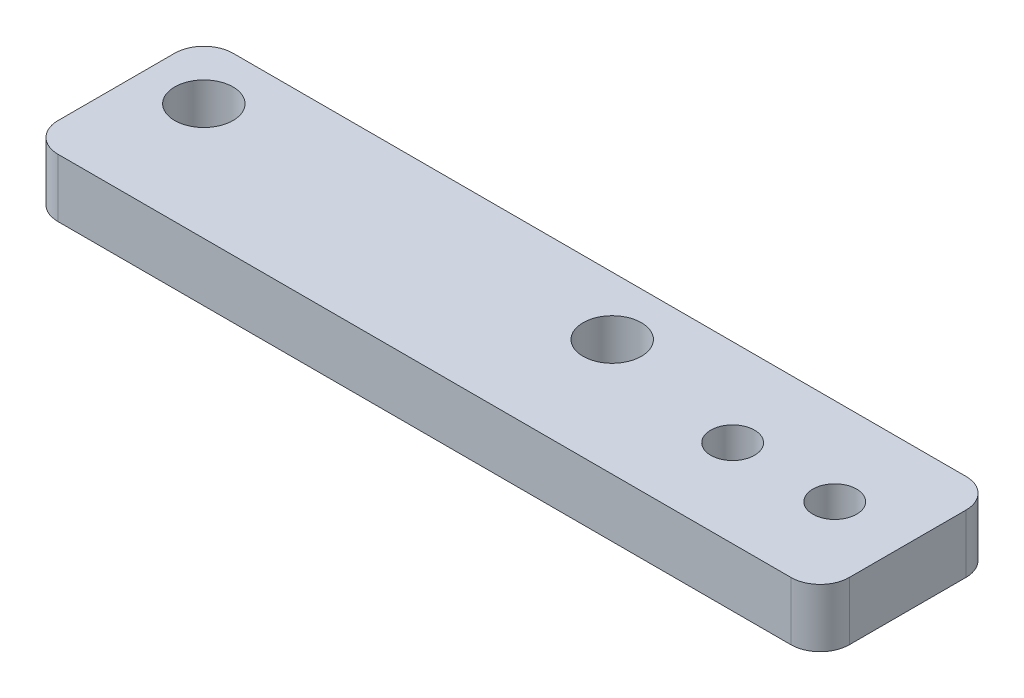
ISO-10303-21;
HEADER;
FILE_DESCRIPTION(('STEP AP214'),'2;1');
FILE_NAME('part.step','',(''),(''),'','','');
FILE_SCHEMA(('AUTOMOTIVE_DESIGN { 1 0 10303 214 1 1 1 1 }'));
ENDSEC;
DATA;
#1=APPLICATION_CONTEXT('core data for automotive mechanical design processes');
#2=APPLICATION_PROTOCOL_DEFINITION('international standard','automotive_design',2000,#1);
#3=PRODUCT_CONTEXT('',#1,'mechanical');
#4=PRODUCT('Part','Part','',(#3));
#5=PRODUCT_RELATED_PRODUCT_CATEGORY('part','',(#4));
#6=PRODUCT_DEFINITION_FORMATION('','',#4);
#7=PRODUCT_DEFINITION_CONTEXT('part definition',#1,'design');
#8=PRODUCT_DEFINITION('design','',#6,#7);
#9=PRODUCT_DEFINITION_SHAPE('','',#8);
#10=(LENGTH_UNIT() NAMED_UNIT(*) SI_UNIT(.MILLI.,.METRE.));
#11=(NAMED_UNIT(*) PLANE_ANGLE_UNIT() SI_UNIT($,.RADIAN.));
#12=(NAMED_UNIT(*) SI_UNIT($,.STERADIAN.) SOLID_ANGLE_UNIT());
#13=UNCERTAINTY_MEASURE_WITH_UNIT(LENGTH_MEASURE(1.E-05),#10,'distance_accuracy_value','');
#14=(GEOMETRIC_REPRESENTATION_CONTEXT(3) GLOBAL_UNCERTAINTY_ASSIGNED_CONTEXT((#13)) GLOBAL_UNIT_ASSIGNED_CONTEXT((#10,
#11,#12)) REPRESENTATION_CONTEXT('',''));
#15=CARTESIAN_POINT('',(0.,0.,0.));
#16=DIRECTION('',(0.,0.,1.));
#17=DIRECTION('',(1.,0.,0.));
#18=AXIS2_PLACEMENT_3D('',#15,#16,#17);
#19=CARTESIAN_POINT('',(0.,4.,0.));
#20=DIRECTION('',(0.,1.,0.));
#21=DIRECTION('',(0.,0.,1.));
#22=AXIS2_PLACEMENT_3D('',#19,#20,#21);
#23=PLANE('',#22);
#24=CARTESIAN_POINT('',(-23.1284134973693,4.,-2.));
#25=DIRECTION('',(0.,1.,0.));
#26=DIRECTION('',(0.,0.,1.));
#27=AXIS2_PLACEMENT_3D('',#24,#25,#26);
#28=CIRCLE('',#27,2.);
#29=CARTESIAN_POINT('',(-23.1284134973693,4.,0.));
#30=VERTEX_POINT('',#29);
#31=EDGE_CURVE('E184',#30,#30,#28,.T.);
#32=ORIENTED_EDGE('',*,*,#31,.F.);
#33=EDGE_LOOP('',(#32));
#34=FACE_BOUND('',#33,.T.);
#35=CARTESIAN_POINT('',(15.1284134973693,4.,0.));
#36=DIRECTION('',(0.,1.,0.));
#37=DIRECTION('',(0.,0.,1.));
#38=AXIS2_PLACEMENT_3D('',#35,#36,#37);
#39=CIRCLE('',#38,1.5);
#40=CARTESIAN_POINT('',(15.1284134973693,4.,1.5));
#41=VERTEX_POINT('',#40);
#42=EDGE_CURVE('E167',#41,#41,#39,.T.);
#43=ORIENTED_EDGE('',*,*,#42,.F.);
#44=EDGE_LOOP('',(#43));
#45=FACE_BOUND('',#44,.T.);
#46=DIRECTION('',(-1.,0.,0.));
#47=VECTOR('',#46,1.);
#48=CARTESIAN_POINT('',(-27.1284134973693,4.,-6.));
#49=LINE('',#48,#47);
#50=CARTESIAN_POINT('',(25.1284134973693,4.,-6.));
#51=VERTEX_POINT('',#50);
#52=CARTESIAN_POINT('',(-25.1284134973693,4.,-6.));
#53=VERTEX_POINT('',#52);
#54=EDGE_CURVE('E174',#51,#53,#49,.T.);
#55=ORIENTED_EDGE('',*,*,#54,.T.);
#56=CARTESIAN_POINT('',(-25.1284134973693,4.,-4.));
#57=DIRECTION('',(0.,1.,0.));
#58=DIRECTION('',(0.,0.,1.));
#59=AXIS2_PLACEMENT_3D('',#56,#57,#58);
#60=CIRCLE('',#59,2.);
#61=CARTESIAN_POINT('',(-27.1284134973693,4.,-4.));
#62=VERTEX_POINT('',#61);
#63=EDGE_CURVE('E151',#53,#62,#60,.T.);
#64=ORIENTED_EDGE('',*,*,#63,.T.);
#65=DIRECTION('',(0.,0.,1.));
#66=VECTOR('',#65,1.);
#67=CARTESIAN_POINT('',(-27.1284134973693,4.,-6.));
#68=LINE('',#67,#66);
#69=CARTESIAN_POINT('',(-27.1284134973693,4.,4.));
#70=VERTEX_POINT('',#69);
#71=EDGE_CURVE('E121',#62,#70,#68,.T.);
#72=ORIENTED_EDGE('',*,*,#71,.T.);
#73=CARTESIAN_POINT('',(-25.1284134973693,4.,4.));
#74=DIRECTION('',(0.,1.,0.));
#75=DIRECTION('',(0.,0.,1.));
#76=AXIS2_PLACEMENT_3D('',#73,#74,#75);
#77=CIRCLE('',#76,2.);
#78=CARTESIAN_POINT('',(-25.1284134973693,4.,6.));
#79=VERTEX_POINT('',#78);
#80=EDGE_CURVE('E58',#70,#79,#77,.T.);
#81=ORIENTED_EDGE('',*,*,#80,.T.);
#82=DIRECTION('',(1.,0.,0.));
#83=VECTOR('',#82,1.);
#84=CARTESIAN_POINT('',(-27.1284134973693,4.,6.));
#85=LINE('',#84,#83);
#86=CARTESIAN_POINT('',(25.1284134973693,4.,6.));
#87=VERTEX_POINT('',#86);
#88=EDGE_CURVE('E137',#79,#87,#85,.T.);
#89=ORIENTED_EDGE('',*,*,#88,.T.);
#90=CARTESIAN_POINT('',(25.1284134973693,4.,4.));
#91=DIRECTION('',(0.,1.,0.));
#92=DIRECTION('',(0.,0.,1.));
#93=AXIS2_PLACEMENT_3D('',#90,#91,#92);
#94=CIRCLE('',#93,2.);
#95=CARTESIAN_POINT('',(27.1284134973693,4.,4.));
#96=VERTEX_POINT('',#95);
#97=EDGE_CURVE('E146',#87,#96,#94,.T.);
#98=ORIENTED_EDGE('',*,*,#97,.T.);
#99=DIRECTION('',(0.,0.,-1.));
#100=VECTOR('',#99,1.);
#101=CARTESIAN_POINT('',(27.1284134973693,4.,-6.));
#102=LINE('',#101,#100);
#103=CARTESIAN_POINT('',(27.1284134973693,4.,-4.));
#104=VERTEX_POINT('',#103);
#105=EDGE_CURVE('E131',#96,#104,#102,.T.);
#106=ORIENTED_EDGE('',*,*,#105,.T.);
#107=CARTESIAN_POINT('',(25.1284134973693,4.,-4.));
#108=DIRECTION('',(0.,1.,0.));
#109=DIRECTION('',(0.,0.,1.));
#110=AXIS2_PLACEMENT_3D('',#107,#108,#109);
#111=CIRCLE('',#110,2.);
#112=EDGE_CURVE('E148',#104,#51,#111,.T.);
#113=ORIENTED_EDGE('',*,*,#112,.T.);
#114=EDGE_LOOP('',(#55,#64,#72,#81,#89,#98,#106,#113));
#115=FACE_BOUND('',#114,.T.);
#116=CARTESIAN_POINT('',(22.1284134973693,4.,0.));
#117=DIRECTION('',(0.,1.,0.));
#118=DIRECTION('',(0.,0.,1.));
#119=AXIS2_PLACEMENT_3D('',#116,#117,#118);
#120=CIRCLE('',#119,1.50000000000001);
#121=CARTESIAN_POINT('',(22.1284134973693,4.,1.50000000000001));
#122=VERTEX_POINT('',#121);
#123=EDGE_CURVE('E179',#122,#122,#120,.T.);
#124=ORIENTED_EDGE('',*,*,#123,.F.);
#125=EDGE_LOOP('',(#124));
#126=FACE_BOUND('',#125,.T.);
#127=CARTESIAN_POINT('',(4.87158650263066,4.,-2.));
#128=DIRECTION('',(0.,1.,0.));
#129=DIRECTION('',(0.,0.,1.));
#130=AXIS2_PLACEMENT_3D('',#127,#128,#129);
#131=CIRCLE('',#130,2.);
#132=CARTESIAN_POINT('',(4.87158650263066,4.,0.));
#133=VERTEX_POINT('',#132);
#134=EDGE_CURVE('E190',#133,#133,#131,.T.);
#135=ORIENTED_EDGE('',*,*,#134,.F.);
#136=EDGE_LOOP('',(#135));
#137=FACE_BOUND('',#136,.T.);
#138=ADVANCED_FACE('F36',(#34,#45,#115,#126,#137),#23,.T.);
#139=CARTESIAN_POINT('',(0.,0.,0.));
#140=DIRECTION('',(0.,1.,0.));
#141=DIRECTION('',(0.,0.,1.));
#142=AXIS2_PLACEMENT_3D('',#139,#140,#141);
#143=PLANE('',#142);
#144=DIRECTION('',(0.,0.,1.));
#145=VECTOR('',#144,1.);
#146=CARTESIAN_POINT('',(-27.1284134973693,0.,-6.));
#147=LINE('',#146,#145);
#148=CARTESIAN_POINT('',(-27.1284134973693,0.,-4.));
#149=VERTEX_POINT('',#148);
#150=CARTESIAN_POINT('',(-27.1284134973693,0.,4.));
#151=VERTEX_POINT('',#150);
#152=EDGE_CURVE('E119',#149,#151,#147,.T.);
#153=ORIENTED_EDGE('',*,*,#152,.F.);
#154=CARTESIAN_POINT('',(-25.1284134973693,0.,-4.));
#155=DIRECTION('',(0.,1.,0.));
#156=DIRECTION('',(0.,0.,1.));
#157=AXIS2_PLACEMENT_3D('',#154,#155,#156);
#158=CIRCLE('',#157,2.);
#159=CARTESIAN_POINT('',(-25.1284134973693,0.,-6.));
#160=VERTEX_POINT('',#159);
#161=EDGE_CURVE('E102',#149,#160,#158,.F.);
#162=ORIENTED_EDGE('',*,*,#161,.T.);
#163=DIRECTION('',(-1.,0.,0.));
#164=VECTOR('',#163,1.);
#165=CARTESIAN_POINT('',(-27.1284134973693,0.,-6.));
#166=LINE('',#165,#164);
#167=CARTESIAN_POINT('',(25.1284134973693,0.,-6.));
#168=VERTEX_POINT('',#167);
#169=EDGE_CURVE('E129',#168,#160,#166,.T.);
#170=ORIENTED_EDGE('',*,*,#169,.F.);
#171=CARTESIAN_POINT('',(25.1284134973693,0.,-4.));
#172=DIRECTION('',(0.,1.,0.));
#173=DIRECTION('',(0.,0.,1.));
#174=AXIS2_PLACEMENT_3D('',#171,#172,#173);
#175=CIRCLE('',#174,2.);
#176=CARTESIAN_POINT('',(27.1284134973693,0.,-4.));
#177=VERTEX_POINT('',#176);
#178=EDGE_CURVE('E140',#168,#177,#175,.F.);
#179=ORIENTED_EDGE('',*,*,#178,.T.);
#180=DIRECTION('',(0.,0.,-1.));
#181=VECTOR('',#180,1.);
#182=CARTESIAN_POINT('',(27.1284134973693,0.,-6.));
#183=LINE('',#182,#181);
#184=CARTESIAN_POINT('',(27.1284134973693,0.,4.));
#185=VERTEX_POINT('',#184);
#186=EDGE_CURVE('E133',#185,#177,#183,.T.);
#187=ORIENTED_EDGE('',*,*,#186,.F.);
#188=CARTESIAN_POINT('',(25.1284134973693,0.,4.));
#189=DIRECTION('',(0.,1.,0.));
#190=DIRECTION('',(0.,0.,1.));
#191=AXIS2_PLACEMENT_3D('',#188,#189,#190);
#192=CIRCLE('',#191,2.);
#193=CARTESIAN_POINT('',(25.1284134973693,0.,6.));
#194=VERTEX_POINT('',#193);
#195=EDGE_CURVE('E122',#185,#194,#192,.F.);
#196=ORIENTED_EDGE('',*,*,#195,.T.);
#197=DIRECTION('',(1.,0.,0.));
#198=VECTOR('',#197,1.);
#199=CARTESIAN_POINT('',(-27.1284134973693,0.,6.));
#200=LINE('',#199,#198);
#201=CARTESIAN_POINT('',(-25.1284134973693,0.,6.));
#202=VERTEX_POINT('',#201);
#203=EDGE_CURVE('E128',#202,#194,#200,.T.);
#204=ORIENTED_EDGE('',*,*,#203,.F.);
#205=CARTESIAN_POINT('',(-25.1284134973693,0.,4.));
#206=DIRECTION('',(0.,1.,0.));
#207=DIRECTION('',(0.,0.,1.));
#208=AXIS2_PLACEMENT_3D('',#205,#206,#207);
#209=CIRCLE('',#208,2.);
#210=EDGE_CURVE('E113',#202,#151,#209,.F.);
#211=ORIENTED_EDGE('',*,*,#210,.T.);
#212=EDGE_LOOP('',(#153,#162,#170,#179,#187,#196,#204,#211));
#213=FACE_BOUND('',#212,.T.);
#214=CARTESIAN_POINT('',(15.1284134973693,0.,0.));
#215=DIRECTION('',(0.,1.,0.));
#216=DIRECTION('',(0.,0.,1.));
#217=AXIS2_PLACEMENT_3D('',#214,#215,#216);
#218=CIRCLE('',#217,1.5);
#219=CARTESIAN_POINT('',(15.1284134973693,0.,1.5));
#220=VERTEX_POINT('',#219);
#221=EDGE_CURVE('E169',#220,#220,#218,.T.);
#222=ORIENTED_EDGE('',*,*,#221,.T.);
#223=EDGE_LOOP('',(#222));
#224=FACE_BOUND('',#223,.T.);
#225=CARTESIAN_POINT('',(22.1284134973693,0.,0.));
#226=DIRECTION('',(0.,1.,0.));
#227=DIRECTION('',(0.,0.,1.));
#228=AXIS2_PLACEMENT_3D('',#225,#226,#227);
#229=CIRCLE('',#228,1.50000000000001);
#230=CARTESIAN_POINT('',(22.1284134973693,0.,1.50000000000001));
#231=VERTEX_POINT('',#230);
#232=EDGE_CURVE('E181',#231,#231,#229,.T.);
#233=ORIENTED_EDGE('',*,*,#232,.T.);
#234=EDGE_LOOP('',(#233));
#235=FACE_BOUND('',#234,.T.);
#236=CARTESIAN_POINT('',(-23.1284134973693,0.,-2.));
#237=DIRECTION('',(0.,1.,0.));
#238=DIRECTION('',(0.,0.,1.));
#239=AXIS2_PLACEMENT_3D('',#236,#237,#238);
#240=CIRCLE('',#239,2.);
#241=CARTESIAN_POINT('',(-23.1284134973693,0.,0.));
#242=VERTEX_POINT('',#241);
#243=EDGE_CURVE('E187',#242,#242,#240,.T.);
#244=ORIENTED_EDGE('',*,*,#243,.T.);
#245=EDGE_LOOP('',(#244));
#246=FACE_BOUND('',#245,.T.);
#247=CARTESIAN_POINT('',(4.87158650263066,0.,-2.));
#248=DIRECTION('',(0.,1.,0.));
#249=DIRECTION('',(0.,0.,1.));
#250=AXIS2_PLACEMENT_3D('',#247,#248,#249);
#251=CIRCLE('',#250,2.);
#252=CARTESIAN_POINT('',(4.87158650263066,0.,0.));
#253=VERTEX_POINT('',#252);
#254=EDGE_CURVE('E193',#253,#253,#251,.T.);
#255=ORIENTED_EDGE('',*,*,#254,.T.);
#256=EDGE_LOOP('',(#255));
#257=FACE_BOUND('',#256,.T.);
#258=ADVANCED_FACE('F125',(#213,#224,#235,#246,#257),#143,.F.);
#259=CARTESIAN_POINT('',(27.1284134973693,4.,-6.));
#260=DIRECTION('',(-1.,0.,0.));
#261=DIRECTION('',(0.,0.,1.));
#262=AXIS2_PLACEMENT_3D('',#259,#260,#261);
#263=PLANE('',#262);
#264=ORIENTED_EDGE('',*,*,#186,.T.);
#265=DIRECTION('',(0.,-1.,0.));
#266=VECTOR('',#265,1.);
#267=CARTESIAN_POINT('',(27.1284134973693,4.,-4.));
#268=LINE('',#267,#266);
#269=EDGE_CURVE('E11',#177,#104,#268,.F.);
#270=ORIENTED_EDGE('',*,*,#269,.T.);
#271=ORIENTED_EDGE('',*,*,#105,.F.);
#272=DIRECTION('',(0.,-1.,0.));
#273=VECTOR('',#272,1.);
#274=CARTESIAN_POINT('',(27.1284134973693,4.,4.));
#275=LINE('',#274,#273);
#276=EDGE_CURVE('E44',#96,#185,#275,.T.);
#277=ORIENTED_EDGE('',*,*,#276,.T.);
#278=EDGE_LOOP('',(#264,#270,#271,#277));
#279=FACE_BOUND('',#278,.T.);
#280=ADVANCED_FACE('F162',(#279),#263,.F.);
#281=CARTESIAN_POINT('',(-27.1284134973693,4.,-6.));
#282=DIRECTION('',(0.,0.,1.));
#283=DIRECTION('',(1.,0.,0.));
#284=AXIS2_PLACEMENT_3D('',#281,#282,#283);
#285=PLANE('',#284);
#286=ORIENTED_EDGE('',*,*,#169,.T.);
#287=DIRECTION('',(0.,-1.,0.));
#288=VECTOR('',#287,1.);
#289=CARTESIAN_POINT('',(-25.1284134973693,4.,-6.));
#290=LINE('',#289,#288);
#291=EDGE_CURVE('E107',#160,#53,#290,.F.);
#292=ORIENTED_EDGE('',*,*,#291,.T.);
#293=ORIENTED_EDGE('',*,*,#54,.F.);
#294=DIRECTION('',(0.,-1.,0.));
#295=VECTOR('',#294,1.);
#296=CARTESIAN_POINT('',(25.1284134973693,4.,-6.));
#297=LINE('',#296,#295);
#298=EDGE_CURVE('E112',#51,#168,#297,.T.);
#299=ORIENTED_EDGE('',*,*,#298,.T.);
#300=EDGE_LOOP('',(#286,#292,#293,#299));
#301=FACE_BOUND('',#300,.T.);
#302=ADVANCED_FACE('F220',(#301),#285,.F.);
#303=CARTESIAN_POINT('',(-27.1284134973693,4.,-6.));
#304=DIRECTION('',(1.,0.,0.));
#305=DIRECTION('',(0.,0.,-1.));
#306=AXIS2_PLACEMENT_3D('',#303,#304,#305);
#307=PLANE('',#306);
#308=ORIENTED_EDGE('',*,*,#71,.F.);
#309=DIRECTION('',(0.,-1.,0.));
#310=VECTOR('',#309,1.);
#311=CARTESIAN_POINT('',(-27.1284134973693,4.,-4.));
#312=LINE('',#311,#310);
#313=EDGE_CURVE('E106',#62,#149,#312,.T.);
#314=ORIENTED_EDGE('',*,*,#313,.T.);
#315=ORIENTED_EDGE('',*,*,#152,.T.);
#316=DIRECTION('',(0.,-1.,0.));
#317=VECTOR('',#316,1.);
#318=CARTESIAN_POINT('',(-27.1284134973693,4.,4.));
#319=LINE('',#318,#317);
#320=EDGE_CURVE('E123',#151,#70,#319,.F.);
#321=ORIENTED_EDGE('',*,*,#320,.T.);
#322=EDGE_LOOP('',(#308,#314,#315,#321));
#323=FACE_BOUND('',#322,.T.);
#324=ADVANCED_FACE('F118',(#323),#307,.F.);
#325=CARTESIAN_POINT('',(-27.1284134973693,4.,6.));
#326=DIRECTION('',(0.,0.,-1.));
#327=DIRECTION('',(-1.,0.,0.));
#328=AXIS2_PLACEMENT_3D('',#325,#326,#327);
#329=PLANE('',#328);
#330=ORIENTED_EDGE('',*,*,#88,.F.);
#331=DIRECTION('',(0.,-1.,0.));
#332=VECTOR('',#331,1.);
#333=CARTESIAN_POINT('',(-25.1284134973693,4.,6.));
#334=LINE('',#333,#332);
#335=EDGE_CURVE('E154',#79,#202,#334,.T.);
#336=ORIENTED_EDGE('',*,*,#335,.T.);
#337=ORIENTED_EDGE('',*,*,#203,.T.);
#338=DIRECTION('',(0.,-1.,0.));
#339=VECTOR('',#338,1.);
#340=CARTESIAN_POINT('',(25.1284134973693,4.,6.));
#341=LINE('',#340,#339);
#342=EDGE_CURVE('E51',#194,#87,#341,.F.);
#343=ORIENTED_EDGE('',*,*,#342,.T.);
#344=EDGE_LOOP('',(#330,#336,#337,#343));
#345=FACE_BOUND('',#344,.T.);
#346=ADVANCED_FACE('F215',(#345),#329,.F.);
#347=CARTESIAN_POINT('',(15.1284134973693,4.,0.));
#348=DIRECTION('',(0.,-1.,0.));
#349=DIRECTION('',(0.,0.,-1.));
#350=AXIS2_PLACEMENT_3D('',#347,#348,#349);
#351=CYLINDRICAL_SURFACE('',#350,1.5);
#352=ORIENTED_EDGE('',*,*,#42,.T.);
#353=EDGE_LOOP('',(#352));
#354=FACE_BOUND('',#353,.T.);
#355=ORIENTED_EDGE('',*,*,#221,.F.);
#356=EDGE_LOOP('',(#355));
#357=FACE_BOUND('',#356,.T.);
#358=ADVANCED_FACE('F212',(#354,#357),#351,.F.);
#359=CARTESIAN_POINT('',(22.1284134973693,4.,0.));
#360=DIRECTION('',(0.,-1.,0.));
#361=DIRECTION('',(0.,0.,-1.));
#362=AXIS2_PLACEMENT_3D('',#359,#360,#361);
#363=CYLINDRICAL_SURFACE('',#362,1.50000000000001);
#364=ORIENTED_EDGE('',*,*,#123,.T.);
#365=EDGE_LOOP('',(#364));
#366=FACE_BOUND('',#365,.T.);
#367=ORIENTED_EDGE('',*,*,#232,.F.);
#368=EDGE_LOOP('',(#367));
#369=FACE_BOUND('',#368,.T.);
#370=ADVANCED_FACE('F244',(#366,#369),#363,.F.);
#371=CARTESIAN_POINT('',(-23.1284134973693,4.,-2.));
#372=DIRECTION('',(0.,-1.,0.));
#373=DIRECTION('',(0.,0.,-1.));
#374=AXIS2_PLACEMENT_3D('',#371,#372,#373);
#375=CYLINDRICAL_SURFACE('',#374,2.);
#376=ORIENTED_EDGE('',*,*,#31,.T.);
#377=EDGE_LOOP('',(#376));
#378=FACE_BOUND('',#377,.T.);
#379=ORIENTED_EDGE('',*,*,#243,.F.);
#380=EDGE_LOOP('',(#379));
#381=FACE_BOUND('',#380,.T.);
#382=ADVANCED_FACE('F247',(#378,#381),#375,.F.);
#383=CARTESIAN_POINT('',(4.87158650263066,4.,-2.));
#384=DIRECTION('',(0.,-1.,0.));
#385=DIRECTION('',(0.,0.,-1.));
#386=AXIS2_PLACEMENT_3D('',#383,#384,#385);
#387=CYLINDRICAL_SURFACE('',#386,2.);
#388=ORIENTED_EDGE('',*,*,#134,.T.);
#389=EDGE_LOOP('',(#388));
#390=FACE_BOUND('',#389,.T.);
#391=ORIENTED_EDGE('',*,*,#254,.F.);
#392=EDGE_LOOP('',(#391));
#393=FACE_BOUND('',#392,.T.);
#394=ADVANCED_FACE('F199',(#390,#393),#387,.F.);
#395=CARTESIAN_POINT('',(-25.1284134973693,4.,-4.));
#396=DIRECTION('',(0.,-1.,0.));
#397=DIRECTION('',(0.,0.,-1.));
#398=AXIS2_PLACEMENT_3D('',#395,#396,#397);
#399=CYLINDRICAL_SURFACE('',#398,2.);
#400=ORIENTED_EDGE('',*,*,#63,.F.);
#401=ORIENTED_EDGE('',*,*,#291,.F.);
#402=ORIENTED_EDGE('',*,*,#161,.F.);
#403=ORIENTED_EDGE('',*,*,#313,.F.);
#404=EDGE_LOOP('',(#400,#401,#402,#403));
#405=FACE_BOUND('',#404,.T.);
#406=ADVANCED_FACE('F105',(#405),#399,.T.);
#407=CARTESIAN_POINT('',(-25.1284134973693,4.,4.));
#408=DIRECTION('',(0.,-1.,0.));
#409=DIRECTION('',(0.,0.,-1.));
#410=AXIS2_PLACEMENT_3D('',#407,#408,#409);
#411=CYLINDRICAL_SURFACE('',#410,2.);
#412=ORIENTED_EDGE('',*,*,#80,.F.);
#413=ORIENTED_EDGE('',*,*,#320,.F.);
#414=ORIENTED_EDGE('',*,*,#210,.F.);
#415=ORIENTED_EDGE('',*,*,#335,.F.);
#416=EDGE_LOOP('',(#412,#413,#414,#415));
#417=FACE_BOUND('',#416,.T.);
#418=ADVANCED_FACE('F228',(#417),#411,.T.);
#419=CARTESIAN_POINT('',(25.1284134973693,4.,-4.));
#420=DIRECTION('',(0.,-1.,0.));
#421=DIRECTION('',(0.,0.,-1.));
#422=AXIS2_PLACEMENT_3D('',#419,#420,#421);
#423=CYLINDRICAL_SURFACE('',#422,2.);
#424=ORIENTED_EDGE('',*,*,#112,.F.);
#425=ORIENTED_EDGE('',*,*,#269,.F.);
#426=ORIENTED_EDGE('',*,*,#178,.F.);
#427=ORIENTED_EDGE('',*,*,#298,.F.);
#428=EDGE_LOOP('',(#424,#425,#426,#427));
#429=FACE_BOUND('',#428,.T.);
#430=ADVANCED_FACE('F230',(#429),#423,.T.);
#431=CARTESIAN_POINT('',(25.1284134973693,4.,4.));
#432=DIRECTION('',(0.,-1.,0.));
#433=DIRECTION('',(0.,0.,-1.));
#434=AXIS2_PLACEMENT_3D('',#431,#432,#433);
#435=CYLINDRICAL_SURFACE('',#434,2.);
#436=ORIENTED_EDGE('',*,*,#97,.F.);
#437=ORIENTED_EDGE('',*,*,#342,.F.);
#438=ORIENTED_EDGE('',*,*,#195,.F.);
#439=ORIENTED_EDGE('',*,*,#276,.F.);
#440=EDGE_LOOP('',(#436,#437,#438,#439));
#441=FACE_BOUND('',#440,.T.);
#442=ADVANCED_FACE('F38',(#441),#435,.T.);
#443=CLOSED_SHELL('',(#138,#258,#280,#302,#324,#346,#358,#370,#382,#394,#406,#418,#430,#442));
#444=MANIFOLD_SOLID_BREP('B2',#443);
#445=ADVANCED_BREP_SHAPE_REPRESENTATION('',(#18,#444),#14);
#446=SHAPE_DEFINITION_REPRESENTATION(#9,#445);
ENDSEC;
END-ISO-10303-21;
